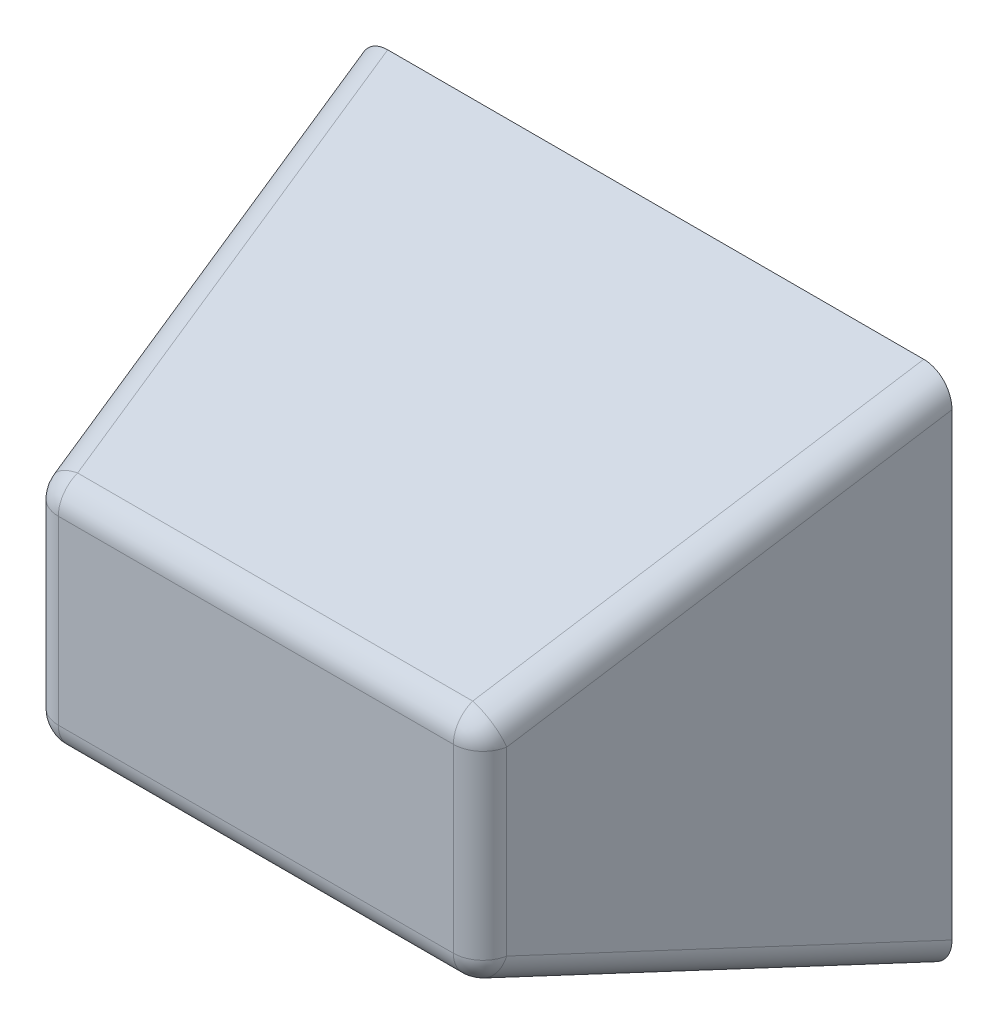
ISO-10303-21;
HEADER;
FILE_DESCRIPTION(('STEP AP214'),'2;1');
FILE_NAME('part.step','',(''),(''),'','','');
FILE_SCHEMA(('AUTOMOTIVE_DESIGN { 1 0 10303 214 1 1 1 1 }'));
ENDSEC;
DATA;
#1=APPLICATION_CONTEXT('core data for automotive mechanical design processes');
#2=APPLICATION_PROTOCOL_DEFINITION('international standard','automotive_design',2000,#1);
#3=PRODUCT_CONTEXT('',#1,'mechanical');
#4=PRODUCT('Part','Part','',(#3));
#5=PRODUCT_RELATED_PRODUCT_CATEGORY('part','',(#4));
#6=PRODUCT_DEFINITION_FORMATION('','',#4);
#7=PRODUCT_DEFINITION_CONTEXT('part definition',#1,'design');
#8=PRODUCT_DEFINITION('design','',#6,#7);
#9=PRODUCT_DEFINITION_SHAPE('','',#8);
#10=(LENGTH_UNIT() NAMED_UNIT(*) SI_UNIT(.MILLI.,.METRE.));
#11=(NAMED_UNIT(*) PLANE_ANGLE_UNIT() SI_UNIT($,.RADIAN.));
#12=(NAMED_UNIT(*) SI_UNIT($,.STERADIAN.) SOLID_ANGLE_UNIT());
#13=UNCERTAINTY_MEASURE_WITH_UNIT(LENGTH_MEASURE(1.E-05),#10,'distance_accuracy_value','');
#14=(GEOMETRIC_REPRESENTATION_CONTEXT(3) GLOBAL_UNCERTAINTY_ASSIGNED_CONTEXT((#13)) GLOBAL_UNIT_ASSIGNED_CONTEXT((#10,
#11,#12)) REPRESENTATION_CONTEXT('',''));
#15=CARTESIAN_POINT('',(0.,0.,0.));
#16=DIRECTION('',(0.,0.,1.));
#17=DIRECTION('',(1.,0.,0.));
#18=AXIS2_PLACEMENT_3D('',#15,#16,#17);
#19=CARTESIAN_POINT('',(0.,0.,0.));
#20=DIRECTION('',(0.,0.,1.));
#21=DIRECTION('',(1.,0.,0.));
#22=AXIS2_PLACEMENT_3D('',#19,#20,#21);
#23=PLANE('',#22);
#24=DIRECTION('',(1.,0.,0.));
#25=VECTOR('',#24,1.);
#26=CARTESIAN_POINT('',(-200.000000000001,-174.999999999999,0.));
#27=LINE('',#26,#25);
#28=CARTESIAN_POINT('',(-180.946304698983,-174.999999999999,0.));
#29=VERTEX_POINT('',#28);
#30=CARTESIAN_POINT('',(180.946304698982,-174.999999999999,0.));
#31=VERTEX_POINT('',#30);
#32=EDGE_CURVE('E234',#29,#31,#27,.T.);
#33=ORIENTED_EDGE('',*,*,#32,.F.);
#34=CARTESIAN_POINT('',(-179.65995523297,-153.672325853498,0.));
#35=DIRECTION('',(0.,0.,1.));
#36=DIRECTION('',(-0.447213595499967,-0.894427190999912,0.));
#37=AXIS2_PLACEMENT_3D('',#34,#35,#36);
#38=ELLIPSE('',#37,21.6468728832629,20.);
#39=CARTESIAN_POINT('',(-200.000000000001,-155.021135188182,0.));
#40=VERTEX_POINT('',#39);
#41=EDGE_CURVE('E12',#29,#40,#38,.F.);
#42=ORIENTED_EDGE('',*,*,#41,.T.);
#43=DIRECTION('',(0.,-1.,0.));
#44=VECTOR('',#43,1.);
#45=CARTESIAN_POINT('',(-200.000000000001,175.000000000001,0.));
#46=LINE('',#45,#44);
#47=CARTESIAN_POINT('',(-200.000000000001,155.021135188184,0.));
#48=VERTEX_POINT('',#47);
#49=EDGE_CURVE('E297',#48,#40,#46,.T.);
#50=ORIENTED_EDGE('',*,*,#49,.F.);
#51=CARTESIAN_POINT('',(-179.65995523297,153.6723258535,0.));
#52=DIRECTION('',(0.,0.,1.));
#53=DIRECTION('',(-0.447213595499961,0.894427190999915,0.));
#54=AXIS2_PLACEMENT_3D('',#51,#52,#53);
#55=ELLIPSE('',#54,21.6468728832629,20.);
#56=CARTESIAN_POINT('',(-180.946304698983,175.000000000001,0.));
#57=VERTEX_POINT('',#56);
#58=EDGE_CURVE('E258',#48,#57,#55,.F.);
#59=ORIENTED_EDGE('',*,*,#58,.T.);
#60=DIRECTION('',(-1.,0.,0.));
#61=VECTOR('',#60,1.);
#62=CARTESIAN_POINT('',(-200.000000000001,175.000000000001,0.));
#63=LINE('',#62,#61);
#64=CARTESIAN_POINT('',(180.946304698982,175.000000000001,0.));
#65=VERTEX_POINT('',#64);
#66=EDGE_CURVE('E155',#65,#57,#63,.T.);
#67=ORIENTED_EDGE('',*,*,#66,.F.);
#68=CARTESIAN_POINT('',(179.659955232968,153.6723258535,0.));
#69=DIRECTION('',(0.,0.,1.));
#70=DIRECTION('',(0.44721359549995,0.89442719099992,0.));
#71=AXIS2_PLACEMENT_3D('',#68,#69,#70);
#72=ELLIPSE('',#71,21.6468728832629,20.);
#73=CARTESIAN_POINT('',(199.999999999999,155.021135188184,0.));
#74=VERTEX_POINT('',#73);
#75=EDGE_CURVE('E262',#65,#74,#72,.F.);
#76=ORIENTED_EDGE('',*,*,#75,.T.);
#77=DIRECTION('',(0.,1.,0.));
#78=VECTOR('',#77,1.);
#79=CARTESIAN_POINT('',(199.999999999999,175.000000000001,0.));
#80=LINE('',#79,#78);
#81=CARTESIAN_POINT('',(199.999999999999,-155.021135188182,0.));
#82=VERTEX_POINT('',#81);
#83=EDGE_CURVE('E51',#82,#74,#80,.T.);
#84=ORIENTED_EDGE('',*,*,#83,.F.);
#85=CARTESIAN_POINT('',(179.659955232968,-153.672325853498,0.));
#86=DIRECTION('',(0.,0.,1.));
#87=DIRECTION('',(0.447213595499957,-0.894427190999917,0.));
#88=AXIS2_PLACEMENT_3D('',#85,#86,#87);
#89=ELLIPSE('',#88,21.6468728832629,20.);
#90=EDGE_CURVE('E57',#82,#31,#89,.F.);
#91=ORIENTED_EDGE('',*,*,#90,.T.);
#92=EDGE_LOOP('',(#33,#42,#50,#59,#67,#76,#84,#91));
#93=FACE_BOUND('',#92,.T.);
#94=ADVANCED_FACE('F47',(#93),#23,.F.);
#95=CARTESIAN_POINT('',(0.,0.,270.));
#96=DIRECTION('',(0.,0.,1.));
#97=DIRECTION('',(1.,0.,0.));
#98=AXIS2_PLACEMENT_3D('',#95,#96,#97);
#99=PLANE('',#98);
#100=DIRECTION('',(0.,-1.,0.));
#101=VECTOR('',#100,1.);
#102=CARTESIAN_POINT('',(-133.363658936673,0.,270.));
#103=LINE('',#102,#101);
#104=CARTESIAN_POINT('',(-133.363658936673,61.0797332609068,270.));
#105=VERTEX_POINT('',#104);
#106=CARTESIAN_POINT('',(-133.363658936673,-61.0797332609067,270.));
#107=VERTEX_POINT('',#106);
#108=EDGE_CURVE('E154',#105,#107,#103,.T.);
#109=ORIENTED_EDGE('',*,*,#108,.T.);
#110=DIRECTION('',(1.,0.,0.));
#111=VECTOR('',#110,1.);
#112=CARTESIAN_POINT('',(0.,-61.0797332609067,270.));
#113=LINE('',#112,#111);
#114=CARTESIAN_POINT('',(133.363658936673,-61.0797332609067,270.));
#115=VERTEX_POINT('',#114);
#116=EDGE_CURVE('E159',#107,#115,#113,.T.);
#117=ORIENTED_EDGE('',*,*,#116,.T.);
#118=DIRECTION('',(0.,1.,0.));
#119=VECTOR('',#118,1.);
#120=CARTESIAN_POINT('',(133.363658936673,0.,270.));
#121=LINE('',#120,#119);
#122=CARTESIAN_POINT('',(133.363658936673,61.0797332609068,270.));
#123=VERTEX_POINT('',#122);
#124=EDGE_CURVE('E131',#115,#123,#121,.T.);
#125=ORIENTED_EDGE('',*,*,#124,.T.);
#126=DIRECTION('',(-1.,0.,0.));
#127=VECTOR('',#126,1.);
#128=CARTESIAN_POINT('',(0.,61.0797332609068,270.));
#129=LINE('',#128,#127);
#130=EDGE_CURVE('E148',#123,#105,#129,.T.);
#131=ORIENTED_EDGE('',*,*,#130,.T.);
#132=EDGE_LOOP('',(#109,#117,#125,#131));
#133=FACE_BOUND('',#132,.T.);
#134=ADVANCED_FACE('F157',(#133),#99,.T.);
#135=CARTESIAN_POINT('',(0.,153.890229191798,56.9963811821477));
#136=DIRECTION('',(0.,0.937748760723703,0.347314355823596));
#137=DIRECTION('',(0.,-0.347314355823596,0.937748760723703));
#138=AXIS2_PLACEMENT_3D('',#135,#136,#137);
#139=PLANE('',#138);
#140=DIRECTION('',(-1.,0.,0.));
#141=VECTOR('',#140,1.);
#142=CARTESIAN_POINT('',(0.,79.8347084753808,256.946287116472));
#143=LINE('',#142,#141);
#144=CARTESIAN_POINT('',(-133.363658936673,79.8347084753808,256.946287116472));
#145=VERTEX_POINT('',#144);
#146=CARTESIAN_POINT('',(133.363658936673,79.8347084753808,256.946287116472));
#147=VERTEX_POINT('',#146);
#148=EDGE_CURVE('E65',#145,#147,#143,.F.);
#149=ORIENTED_EDGE('',*,*,#148,.T.);
#150=DIRECTION('',(0.171096477707286,0.34219295541458,-0.923920979619359));
#151=VECTOR('',#150,1.);
#152=CARTESIAN_POINT('',(165.403380088356,143.914150778749,83.9317928973801));
#153=LINE('',#152,#151);
#154=EDGE_CURVE('E256',#147,#65,#153,.T.);
#155=ORIENTED_EDGE('',*,*,#154,.T.);
#156=ORIENTED_EDGE('',*,*,#66,.T.);
#157=DIRECTION('',(-0.171096477707291,0.34219295541458,-0.923920979619358));
#158=VECTOR('',#157,1.);
#159=CARTESIAN_POINT('',(-165.403380088357,143.914150778748,83.9317928973811));
#160=LINE('',#159,#158);
#161=EDGE_CURVE('E70',#57,#145,#160,.F.);
#162=ORIENTED_EDGE('',*,*,#161,.T.);
#163=EDGE_LOOP('',(#149,#155,#156,#162));
#164=FACE_BOUND('',#163,.T.);
#165=ADVANCED_FACE('F356',(#164),#139,.T.);
#166=CARTESIAN_POINT('',(-193.368700265253,0.,35.8090185676399));
#167=DIRECTION('',(-0.98328200498446,0.,0.18208926018231));
#168=DIRECTION('',(0.18208926018231,0.,0.98328200498446));
#169=AXIS2_PLACEMENT_3D('',#166,#167,#168);
#170=PLANE('',#169);
#171=ORIENTED_EDGE('',*,*,#49,.T.);
#172=DIRECTION('',(-0.171096477707291,-0.342192955414574,-0.92392097961936));
#173=VECTOR('',#172,1.);
#174=CARTESIAN_POINT('',(-185.069020188046,-125.159175564273,80.6272909845542));
#175=LINE('',#174,#173);
#176=CARTESIAN_POINT('',(-153.029299036362,-61.0797332609067,253.641785203646));
#177=VERTEX_POINT('',#176);
#178=EDGE_CURVE('E240',#40,#177,#175,.F.);
#179=ORIENTED_EDGE('',*,*,#178,.T.);
#180=DIRECTION('',(0.,-1.,0.));
#181=VECTOR('',#180,1.);
#182=CARTESIAN_POINT('',(-153.029299036362,0.,253.641785203646));
#183=LINE('',#182,#181);
#184=CARTESIAN_POINT('',(-153.029299036362,61.0797332609067,253.641785203646));
#185=VERTEX_POINT('',#184);
#186=EDGE_CURVE('E321',#177,#185,#183,.F.);
#187=ORIENTED_EDGE('',*,*,#186,.T.);
#188=DIRECTION('',(-0.171096477707291,0.34219295541458,-0.923920979619358));
#189=VECTOR('',#188,1.);
#190=CARTESIAN_POINT('',(-185.069020188046,125.159175564274,80.6272909845553));
#191=LINE('',#190,#189);
#192=EDGE_CURVE('E319',#185,#48,#191,.T.);
#193=ORIENTED_EDGE('',*,*,#192,.T.);
#194=EDGE_LOOP('',(#171,#179,#187,#193));
#195=FACE_BOUND('',#194,.T.);
#196=ADVANCED_FACE('F196',(#195),#170,.T.);
#197=CARTESIAN_POINT('',(193.368700265252,0.,35.8090185676387));
#198=DIRECTION('',(0.983282004984461,0.,0.182089260182305));
#199=DIRECTION('',(0.182089260182305,0.,-0.983282004984461));
#200=AXIS2_PLACEMENT_3D('',#197,#198,#199);
#201=PLANE('',#200);
#202=DIRECTION('',(0.,1.,0.));
#203=VECTOR('',#202,1.);
#204=CARTESIAN_POINT('',(153.029299036362,0.,253.641785203646));
#205=LINE('',#204,#203);
#206=CARTESIAN_POINT('',(153.029299036362,61.0797332609068,253.641785203646));
#207=VERTEX_POINT('',#206);
#208=CARTESIAN_POINT('',(153.029299036362,-61.0797332609067,253.641785203646));
#209=VERTEX_POINT('',#208);
#210=EDGE_CURVE('E133',#207,#209,#205,.F.);
#211=ORIENTED_EDGE('',*,*,#210,.T.);
#212=DIRECTION('',(0.171096477707287,-0.342192955414574,-0.923920979619361));
#213=VECTOR('',#212,1.);
#214=CARTESIAN_POINT('',(185.069020188045,-125.159175564274,80.6272909845533));
#215=LINE('',#214,#213);
#216=EDGE_CURVE('E322',#209,#82,#215,.T.);
#217=ORIENTED_EDGE('',*,*,#216,.T.);
#218=ORIENTED_EDGE('',*,*,#83,.T.);
#219=DIRECTION('',(0.171096477707286,0.34219295541458,-0.923920979619359));
#220=VECTOR('',#219,1.);
#221=CARTESIAN_POINT('',(185.069020188045,125.159175564275,80.6272909845543));
#222=LINE('',#221,#220);
#223=EDGE_CURVE('E162',#74,#207,#222,.F.);
#224=ORIENTED_EDGE('',*,*,#223,.T.);
#225=EDGE_LOOP('',(#211,#217,#218,#224));
#226=FACE_BOUND('',#225,.T.);
#227=ADVANCED_FACE('F186',(#226),#201,.T.);
#228=CARTESIAN_POINT('',(0.,-153.890229191797,56.9963811821464));
#229=DIRECTION('',(0.,-0.937748760723705,0.347314355823591));
#230=DIRECTION('',(0.,-0.347314355823591,-0.937748760723705));
#231=AXIS2_PLACEMENT_3D('',#228,#229,#230);
#232=PLANE('',#231);
#233=DIRECTION('',(1.,0.,0.));
#234=VECTOR('',#233,1.);
#235=CARTESIAN_POINT('',(0.,-79.8347084753808,256.946287116472));
#236=LINE('',#235,#234);
#237=CARTESIAN_POINT('',(133.363658936673,-79.8347084753808,256.946287116472));
#238=VERTEX_POINT('',#237);
#239=CARTESIAN_POINT('',(-133.363658936673,-79.8347084753808,256.946287116472));
#240=VERTEX_POINT('',#239);
#241=EDGE_CURVE('E239',#238,#240,#236,.F.);
#242=ORIENTED_EDGE('',*,*,#241,.T.);
#243=DIRECTION('',(-0.171096477707291,-0.342192955414574,-0.92392097961936));
#244=VECTOR('',#243,1.);
#245=CARTESIAN_POINT('',(-165.403380088357,-143.914150778748,83.9317928973798));
#246=LINE('',#245,#244);
#247=EDGE_CURVE('E244',#240,#29,#246,.T.);
#248=ORIENTED_EDGE('',*,*,#247,.T.);
#249=ORIENTED_EDGE('',*,*,#32,.T.);
#250=DIRECTION('',(0.171096477707287,-0.342192955414574,-0.923920979619361));
#251=VECTOR('',#250,1.);
#252=CARTESIAN_POINT('',(165.403380088356,-143.914150778748,83.931792897379));
#253=LINE('',#252,#251);
#254=EDGE_CURVE('E237',#31,#238,#253,.F.);
#255=ORIENTED_EDGE('',*,*,#254,.T.);
#256=EDGE_LOOP('',(#242,#248,#249,#255));
#257=FACE_BOUND('',#256,.T.);
#258=ADVANCED_FACE('F195',(#257),#232,.T.);
#259=CARTESIAN_POINT('',(-165.403380088357,-125.159175564273,76.985505780908));
#260=DIRECTION('',(-0.171096477707291,-0.342192955414574,-0.92392097961936));
#261=DIRECTION('',(0.,0.937748760723705,-0.347314355823591));
#262=AXIS2_PLACEMENT_3D('',#259,#260,#261);
#263=CYLINDRICAL_SURFACE('',#262,20.);
#264=ORIENTED_EDGE('',*,*,#41,.F.);
#265=ORIENTED_EDGE('',*,*,#247,.F.);
#266=CARTESIAN_POINT('',(-133.363658936673,-61.0797332609067,250.));
#267=DIRECTION('',(0.171096477707292,0.342192955414574,0.923920979619359));
#268=DIRECTION('',(0.,-0.937748760723705,0.347314355823591));
#269=AXIS2_PLACEMENT_3D('',#266,#267,#268);
#270=CIRCLE('',#269,20.);
#271=EDGE_CURVE('E293',#177,#240,#270,.T.);
#272=ORIENTED_EDGE('',*,*,#271,.F.);
#273=ORIENTED_EDGE('',*,*,#178,.F.);
#274=EDGE_LOOP('',(#264,#265,#272,#273));
#275=FACE_BOUND('',#274,.T.);
#276=ADVANCED_FACE('F49',(#275),#263,.T.);
#277=CARTESIAN_POINT('',(-133.363658936673,0.,250.));
#278=DIRECTION('',(0.,-1.,0.));
#279=DIRECTION('',(1.,0.,0.));
#280=AXIS2_PLACEMENT_3D('',#277,#278,#279);
#281=CYLINDRICAL_SURFACE('',#280,20.);
#282=CARTESIAN_POINT('',(-133.363658936673,61.0797332609067,250.));
#283=DIRECTION('',(0.,1.,0.));
#284=DIRECTION('',(0.,0.,1.));
#285=AXIS2_PLACEMENT_3D('',#282,#283,#284);
#286=CIRCLE('',#285,20.);
#287=EDGE_CURVE('E287',#185,#105,#286,.T.);
#288=ORIENTED_EDGE('',*,*,#287,.F.);
#289=ORIENTED_EDGE('',*,*,#186,.F.);
#290=CARTESIAN_POINT('',(-133.363658936673,-61.0797332609067,250.));
#291=DIRECTION('',(0.,-1.,0.));
#292=DIRECTION('',(1.,0.,0.));
#293=AXIS2_PLACEMENT_3D('',#290,#291,#292);
#294=CIRCLE('',#293,20.);
#295=EDGE_CURVE('E290',#107,#177,#294,.T.);
#296=ORIENTED_EDGE('',*,*,#295,.F.);
#297=ORIENTED_EDGE('',*,*,#108,.F.);
#298=EDGE_LOOP('',(#288,#289,#296,#297));
#299=FACE_BOUND('',#298,.T.);
#300=ADVANCED_FACE('F334',(#299),#281,.T.);
#301=CARTESIAN_POINT('',(-165.403380088357,125.159175564274,76.9855057809091));
#302=DIRECTION('',(-0.171096477707291,0.34219295541458,-0.923920979619358));
#303=DIRECTION('',(0.,0.937748760723703,0.347314355823596));
#304=AXIS2_PLACEMENT_3D('',#301,#302,#303);
#305=CYLINDRICAL_SURFACE('',#304,20.);
#306=ORIENTED_EDGE('',*,*,#58,.F.);
#307=ORIENTED_EDGE('',*,*,#192,.F.);
#308=CARTESIAN_POINT('',(-133.363658936673,61.0797332609068,250.));
#309=DIRECTION('',(0.171096477707292,-0.34219295541458,0.923920979619357));
#310=DIRECTION('',(0.,-0.937748760723703,-0.347314355823597));
#311=AXIS2_PLACEMENT_3D('',#308,#309,#310);
#312=CIRCLE('',#311,20.);
#313=EDGE_CURVE('E284',#145,#185,#312,.T.);
#314=ORIENTED_EDGE('',*,*,#313,.F.);
#315=ORIENTED_EDGE('',*,*,#161,.F.);
#316=EDGE_LOOP('',(#306,#307,#314,#315));
#317=FACE_BOUND('',#316,.T.);
#318=ADVANCED_FACE('F407',(#317),#305,.T.);
#319=CARTESIAN_POINT('',(-133.363658936673,-61.0797332609067,250.));
#320=DIRECTION('',(0.,0.,1.));
#321=DIRECTION('',(1.,0.,0.));
#322=AXIS2_PLACEMENT_3D('',#319,#320,#321);
#323=SPHERICAL_SURFACE('',#322,20.);
#324=ORIENTED_EDGE('',*,*,#295,.T.);
#325=ORIENTED_EDGE('',*,*,#271,.T.);
#326=CARTESIAN_POINT('',(-133.363658936673,-61.0797332609067,250.));
#327=DIRECTION('',(-1.,0.,0.));
#328=DIRECTION('',(0.,0.,1.));
#329=AXIS2_PLACEMENT_3D('',#326,#327,#328);
#330=CIRCLE('',#329,20.);
#331=EDGE_CURVE('E281',#107,#240,#330,.F.);
#332=ORIENTED_EDGE('',*,*,#331,.F.);
#333=EDGE_LOOP('',(#324,#325,#332));
#334=FACE_BOUND('',#333,.T.);
#335=ADVANCED_FACE('F338',(#334),#323,.T.);
#336=CARTESIAN_POINT('',(-133.363658936673,61.0797332609068,250.));
#337=DIRECTION('',(0.,0.,1.));
#338=DIRECTION('',(1.,0.,0.));
#339=AXIS2_PLACEMENT_3D('',#336,#337,#338);
#340=SPHERICAL_SURFACE('',#339,20.);
#341=ORIENTED_EDGE('',*,*,#313,.T.);
#342=ORIENTED_EDGE('',*,*,#287,.T.);
#343=CARTESIAN_POINT('',(-133.363658936673,61.0797332609068,250.));
#344=DIRECTION('',(-1.,0.,0.));
#345=DIRECTION('',(0.,-1.,0.));
#346=AXIS2_PLACEMENT_3D('',#343,#344,#345);
#347=CIRCLE('',#346,20.);
#348=EDGE_CURVE('E151',#145,#105,#347,.F.);
#349=ORIENTED_EDGE('',*,*,#348,.F.);
#350=EDGE_LOOP('',(#341,#342,#349));
#351=FACE_BOUND('',#350,.T.);
#352=ADVANCED_FACE('F422',(#351),#340,.T.);
#353=CARTESIAN_POINT('',(165.403380088356,-125.159175564274,76.9855057809072));
#354=DIRECTION('',(0.171096477707287,-0.342192955414574,-0.923920979619361));
#355=DIRECTION('',(0.,0.937748760723705,-0.347314355823591));
#356=AXIS2_PLACEMENT_3D('',#353,#354,#355);
#357=CYLINDRICAL_SURFACE('',#356,20.);
#358=ORIENTED_EDGE('',*,*,#90,.F.);
#359=ORIENTED_EDGE('',*,*,#216,.F.);
#360=CARTESIAN_POINT('',(133.363658936673,-61.0797332609067,250.));
#361=DIRECTION('',(-0.171096477707288,0.342192955414575,0.92392097961936));
#362=DIRECTION('',(0.,-0.937748760723705,0.347314355823591));
#363=AXIS2_PLACEMENT_3D('',#360,#361,#362);
#364=CIRCLE('',#363,20.);
#365=EDGE_CURVE('E277',#238,#209,#364,.T.);
#366=ORIENTED_EDGE('',*,*,#365,.F.);
#367=ORIENTED_EDGE('',*,*,#254,.F.);
#368=EDGE_LOOP('',(#358,#359,#366,#367));
#369=FACE_BOUND('',#368,.T.);
#370=ADVANCED_FACE('F350',(#369),#357,.T.);
#371=CARTESIAN_POINT('',(0.,-61.0797332609067,250.));
#372=DIRECTION('',(1.,0.,0.));
#373=DIRECTION('',(0.,0.,-1.));
#374=AXIS2_PLACEMENT_3D('',#371,#372,#373);
#375=CYLINDRICAL_SURFACE('',#374,20.);
#376=ORIENTED_EDGE('',*,*,#331,.T.);
#377=ORIENTED_EDGE('',*,*,#241,.F.);
#378=CARTESIAN_POINT('',(133.363658936673,-61.0797332609067,250.));
#379=DIRECTION('',(1.,0.,0.));
#380=DIRECTION('',(0.,1.,0.));
#381=AXIS2_PLACEMENT_3D('',#378,#379,#380);
#382=CIRCLE('',#381,20.);
#383=EDGE_CURVE('E145',#115,#238,#382,.T.);
#384=ORIENTED_EDGE('',*,*,#383,.F.);
#385=ORIENTED_EDGE('',*,*,#116,.F.);
#386=EDGE_LOOP('',(#376,#377,#384,#385));
#387=FACE_BOUND('',#386,.T.);
#388=ADVANCED_FACE('F341',(#387),#375,.T.);
#389=CARTESIAN_POINT('',(0.,61.0797332609068,250.));
#390=DIRECTION('',(-1.,0.,0.));
#391=DIRECTION('',(0.,0.,1.));
#392=AXIS2_PLACEMENT_3D('',#389,#390,#391);
#393=CYLINDRICAL_SURFACE('',#392,20.);
#394=ORIENTED_EDGE('',*,*,#348,.T.);
#395=ORIENTED_EDGE('',*,*,#130,.F.);
#396=CARTESIAN_POINT('',(133.363658936673,61.0797332609068,250.));
#397=DIRECTION('',(1.,0.,0.));
#398=DIRECTION('',(0.,0.,-1.));
#399=AXIS2_PLACEMENT_3D('',#396,#397,#398);
#400=CIRCLE('',#399,20.);
#401=EDGE_CURVE('E139',#147,#123,#400,.T.);
#402=ORIENTED_EDGE('',*,*,#401,.F.);
#403=ORIENTED_EDGE('',*,*,#148,.F.);
#404=EDGE_LOOP('',(#394,#395,#402,#403));
#405=FACE_BOUND('',#404,.T.);
#406=ADVANCED_FACE('F149',(#405),#393,.T.);
#407=CARTESIAN_POINT('',(165.403380088356,125.159175564275,76.9855057809082));
#408=DIRECTION('',(0.171096477707286,0.34219295541458,-0.923920979619359));
#409=DIRECTION('',(0.,0.937748760723703,0.347314355823596));
#410=AXIS2_PLACEMENT_3D('',#407,#408,#409);
#411=CYLINDRICAL_SURFACE('',#410,20.);
#412=ORIENTED_EDGE('',*,*,#75,.F.);
#413=ORIENTED_EDGE('',*,*,#154,.F.);
#414=CARTESIAN_POINT('',(133.363658936673,61.0797332609067,250.));
#415=DIRECTION('',(-0.171096477707287,-0.34219295541458,0.923920979619359));
#416=DIRECTION('',(0.,-0.937748760723703,-0.347314355823597));
#417=AXIS2_PLACEMENT_3D('',#414,#415,#416);
#418=CIRCLE('',#417,20.);
#419=EDGE_CURVE('E143',#207,#147,#418,.T.);
#420=ORIENTED_EDGE('',*,*,#419,.F.);
#421=ORIENTED_EDGE('',*,*,#223,.F.);
#422=EDGE_LOOP('',(#412,#413,#420,#421));
#423=FACE_BOUND('',#422,.T.);
#424=ADVANCED_FACE('F355',(#423),#411,.T.);
#425=CARTESIAN_POINT('',(133.363658936673,-61.0797332609067,250.));
#426=DIRECTION('',(0.,0.,1.));
#427=DIRECTION('',(1.,0.,0.));
#428=AXIS2_PLACEMENT_3D('',#425,#426,#427);
#429=SPHERICAL_SURFACE('',#428,20.);
#430=ORIENTED_EDGE('',*,*,#383,.T.);
#431=ORIENTED_EDGE('',*,*,#365,.T.);
#432=CARTESIAN_POINT('',(133.363658936673,-61.0797332609067,250.));
#433=DIRECTION('',(0.,-1.,0.));
#434=DIRECTION('',(0.,0.,-1.));
#435=AXIS2_PLACEMENT_3D('',#432,#433,#434);
#436=CIRCLE('',#435,20.);
#437=EDGE_CURVE('E136',#115,#209,#436,.F.);
#438=ORIENTED_EDGE('',*,*,#437,.F.);
#439=EDGE_LOOP('',(#430,#431,#438));
#440=FACE_BOUND('',#439,.T.);
#441=ADVANCED_FACE('F345',(#440),#429,.T.);
#442=CARTESIAN_POINT('',(133.363658936673,61.0797332609068,250.));
#443=DIRECTION('',(0.,0.,1.));
#444=DIRECTION('',(1.,0.,0.));
#445=AXIS2_PLACEMENT_3D('',#442,#443,#444);
#446=SPHERICAL_SURFACE('',#445,20.);
#447=ORIENTED_EDGE('',*,*,#419,.T.);
#448=ORIENTED_EDGE('',*,*,#401,.T.);
#449=CARTESIAN_POINT('',(133.363658936673,61.0797332609068,250.));
#450=DIRECTION('',(0.,1.,0.));
#451=DIRECTION('',(0.,0.,1.));
#452=AXIS2_PLACEMENT_3D('',#449,#450,#451);
#453=CIRCLE('',#452,20.);
#454=EDGE_CURVE('E127',#207,#123,#453,.F.);
#455=ORIENTED_EDGE('',*,*,#454,.F.);
#456=EDGE_LOOP('',(#447,#448,#455));
#457=FACE_BOUND('',#456,.T.);
#458=ADVANCED_FACE('F141',(#457),#446,.T.);
#459=CARTESIAN_POINT('',(133.363658936673,0.,250.));
#460=DIRECTION('',(0.,1.,0.));
#461=DIRECTION('',(-1.,0.,0.));
#462=AXIS2_PLACEMENT_3D('',#459,#460,#461);
#463=CYLINDRICAL_SURFACE('',#462,20.);
#464=ORIENTED_EDGE('',*,*,#437,.T.);
#465=ORIENTED_EDGE('',*,*,#210,.F.);
#466=ORIENTED_EDGE('',*,*,#454,.T.);
#467=ORIENTED_EDGE('',*,*,#124,.F.);
#468=EDGE_LOOP('',(#464,#465,#466,#467));
#469=FACE_BOUND('',#468,.T.);
#470=ADVANCED_FACE('F129',(#469),#463,.T.);
#471=CLOSED_SHELL('',(#94,#134,#165,#196,#227,#258,#276,#300,#318,#335,#352,#370,#388,#406,#424,
#441,#458,#470));
#472=MANIFOLD_SOLID_BREP('B2',#471);
#473=ADVANCED_BREP_SHAPE_REPRESENTATION('',(#18,#472),#14);
#474=SHAPE_DEFINITION_REPRESENTATION(#9,#473);
ENDSEC;
END-ISO-10303-21;
